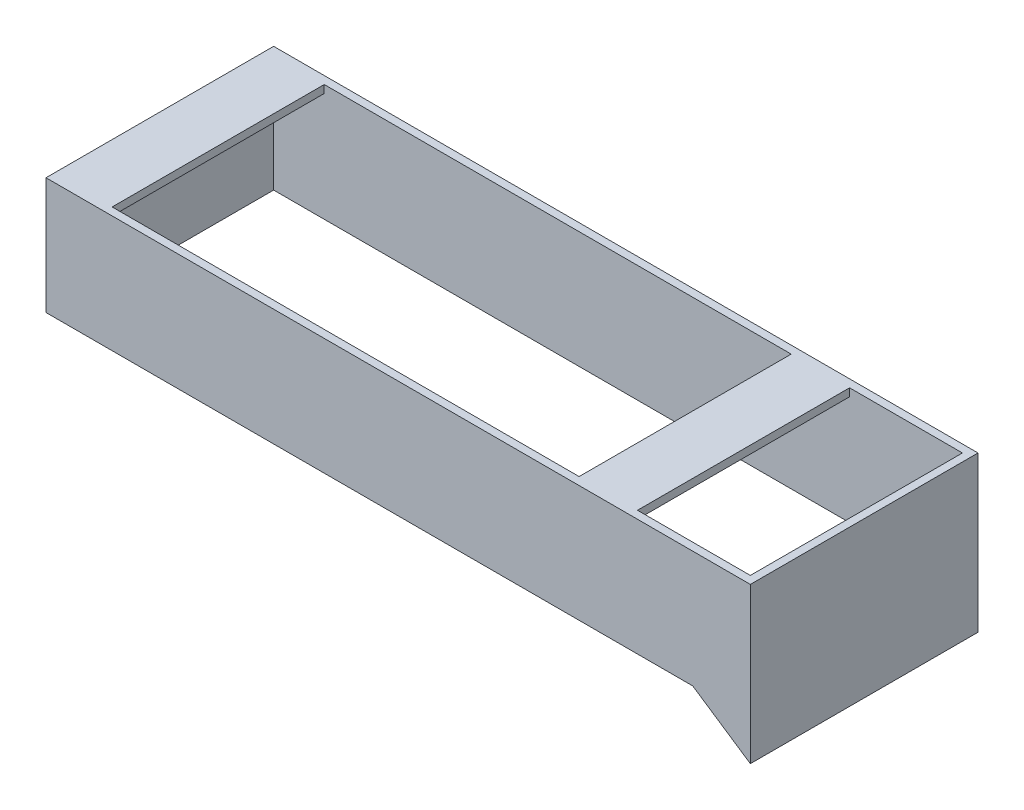
ISO-10303-21;
HEADER;
FILE_DESCRIPTION(('STEP AP214'),'2;1');
FILE_NAME('part.step','',(''),(''),'','','');
FILE_SCHEMA(('AUTOMOTIVE_DESIGN { 1 0 10303 214 1 1 1 1 }'));
ENDSEC;
DATA;
#1=APPLICATION_CONTEXT('core data for automotive mechanical design processes');
#2=APPLICATION_PROTOCOL_DEFINITION('international standard','automotive_design',2000,#1);
#3=PRODUCT_CONTEXT('',#1,'mechanical');
#4=PRODUCT('Part','Part','',(#3));
#5=PRODUCT_RELATED_PRODUCT_CATEGORY('part','',(#4));
#6=PRODUCT_DEFINITION_FORMATION('','',#4);
#7=PRODUCT_DEFINITION_CONTEXT('part definition',#1,'design');
#8=PRODUCT_DEFINITION('design','',#6,#7);
#9=PRODUCT_DEFINITION_SHAPE('','',#8);
#10=(LENGTH_UNIT() NAMED_UNIT(*) SI_UNIT(.MILLI.,.METRE.));
#11=(NAMED_UNIT(*) PLANE_ANGLE_UNIT() SI_UNIT($,.RADIAN.));
#12=(NAMED_UNIT(*) SI_UNIT($,.STERADIAN.) SOLID_ANGLE_UNIT());
#13=UNCERTAINTY_MEASURE_WITH_UNIT(LENGTH_MEASURE(1.E-05),#10,'distance_accuracy_value','');
#14=(GEOMETRIC_REPRESENTATION_CONTEXT(3) GLOBAL_UNCERTAINTY_ASSIGNED_CONTEXT((#13)) GLOBAL_UNIT_ASSIGNED_CONTEXT((#10,
#11,#12)) REPRESENTATION_CONTEXT('',''));
#15=CARTESIAN_POINT('',(0.,0.,0.));
#16=DIRECTION('',(0.,0.,1.));
#17=DIRECTION('',(1.,0.,0.));
#18=AXIS2_PLACEMENT_3D('',#15,#16,#17);
#19=CARTESIAN_POINT('',(-88.5,30.,27.25));
#20=DIRECTION('',(1.,0.,0.));
#21=DIRECTION('',(0.,0.,-1.));
#22=AXIS2_PLACEMENT_3D('',#19,#20,#21);
#23=PLANE('',#22);
#24=DIRECTION('',(0.,-1.,0.));
#25=VECTOR('',#24,1.);
#26=CARTESIAN_POINT('',(-88.5,30.,-27.25));
#27=LINE('',#26,#25);
#28=CARTESIAN_POINT('',(-88.5,28.,-27.25));
#29=VERTEX_POINT('',#28);
#30=CARTESIAN_POINT('',(-88.5,0.,-27.25));
#31=VERTEX_POINT('',#30);
#32=EDGE_CURVE('E264',#29,#31,#27,.T.);
#33=ORIENTED_EDGE('',*,*,#32,.F.);
#34=DIRECTION('',(0.,0.,1.));
#35=VECTOR('',#34,1.);
#36=CARTESIAN_POINT('',(-88.5,28.,27.25));
#37=LINE('',#36,#35);
#38=CARTESIAN_POINT('',(-88.5,28.,27.25));
#39=VERTEX_POINT('',#38);
#40=EDGE_CURVE('E204',#29,#39,#37,.T.);
#41=ORIENTED_EDGE('',*,*,#40,.T.);
#42=DIRECTION('',(0.,-1.,0.));
#43=VECTOR('',#42,1.);
#44=CARTESIAN_POINT('',(-88.5,30.,27.25));
#45=LINE('',#44,#43);
#46=CARTESIAN_POINT('',(-88.5,0.,27.25));
#47=VERTEX_POINT('',#46);
#48=EDGE_CURVE('E261',#39,#47,#45,.T.);
#49=ORIENTED_EDGE('',*,*,#48,.T.);
#50=DIRECTION('',(0.,0.,1.));
#51=VECTOR('',#50,1.);
#52=CARTESIAN_POINT('',(-88.5,0.,27.25));
#53=LINE('',#52,#51);
#54=EDGE_CURVE('E252',#31,#47,#53,.T.);
#55=ORIENTED_EDGE('',*,*,#54,.F.);
#56=EDGE_LOOP('',(#33,#41,#49,#55));
#57=FACE_BOUND('',#56,.T.);
#58=ADVANCED_FACE('F43',(#57),#23,.T.);
#59=CARTESIAN_POINT('',(0.,30.,0.));
#60=DIRECTION('',(0.,-1.,0.));
#61=DIRECTION('',(0.,0.,-1.));
#62=AXIS2_PLACEMENT_3D('',#59,#60,#61);
#63=PLANE('',#62);
#64=DIRECTION('',(0.,0.,-1.));
#65=VECTOR('',#64,1.);
#66=CARTESIAN_POINT('',(59.4977105585169,30.,-29.25));
#67=LINE('',#66,#65);
#68=CARTESIAN_POINT('',(59.4977105585169,30.,27.25));
#69=VERTEX_POINT('',#68);
#70=CARTESIAN_POINT('',(59.4977105585169,30.,-27.25));
#71=VERTEX_POINT('',#70);
#72=EDGE_CURVE('E162',#69,#71,#67,.T.);
#73=ORIENTED_EDGE('',*,*,#72,.T.);
#74=DIRECTION('',(-1.,0.,0.));
#75=VECTOR('',#74,1.);
#76=CARTESIAN_POINT('',(-88.5,30.,-27.25));
#77=LINE('',#76,#75);
#78=CARTESIAN_POINT('',(88.5,30.,-27.25));
#79=VERTEX_POINT('',#78);
#80=EDGE_CURVE('E169',#79,#71,#77,.T.);
#81=ORIENTED_EDGE('',*,*,#80,.F.);
#82=DIRECTION('',(0.,0.,-1.));
#83=VECTOR('',#82,1.);
#84=CARTESIAN_POINT('',(88.5,30.,27.25));
#85=LINE('',#84,#83);
#86=CARTESIAN_POINT('',(88.5,30.,27.25));
#87=VERTEX_POINT('',#86);
#88=EDGE_CURVE('E163',#87,#79,#85,.T.);
#89=ORIENTED_EDGE('',*,*,#88,.F.);
#90=DIRECTION('',(1.,0.,0.));
#91=VECTOR('',#90,1.);
#92=CARTESIAN_POINT('',(-88.5,30.,27.25));
#93=LINE('',#92,#91);
#94=EDGE_CURVE('E156',#69,#87,#93,.T.);
#95=ORIENTED_EDGE('',*,*,#94,.F.);
#96=EDGE_LOOP('',(#73,#81,#89,#95));
#97=FACE_BOUND('',#96,.T.);
#98=DIRECTION('',(0.,0.,1.));
#99=VECTOR('',#98,1.);
#100=CARTESIAN_POINT('',(44.4977105585169,30.,-29.25));
#101=LINE('',#100,#99);
#102=CARTESIAN_POINT('',(44.4977105585169,30.,-27.25));
#103=VERTEX_POINT('',#102);
#104=CARTESIAN_POINT('',(44.4977105585169,30.,27.25));
#105=VERTEX_POINT('',#104);
#106=EDGE_CURVE('E179',#103,#105,#101,.T.);
#107=ORIENTED_EDGE('',*,*,#106,.T.);
#108=CARTESIAN_POINT('',(-75.5,30.,27.25));
#109=VERTEX_POINT('',#108);
#110=EDGE_CURVE('E168',#109,#105,#93,.T.);
#111=ORIENTED_EDGE('',*,*,#110,.F.);
#112=DIRECTION('',(0.,0.,-1.));
#113=VECTOR('',#112,1.);
#114=CARTESIAN_POINT('',(-75.5,30.,-29.25));
#115=LINE('',#114,#113);
#116=CARTESIAN_POINT('',(-75.5,30.,-27.25));
#117=VERTEX_POINT('',#116);
#118=EDGE_CURVE('E199',#109,#117,#115,.T.);
#119=ORIENTED_EDGE('',*,*,#118,.T.);
#120=EDGE_CURVE('E243',#103,#117,#77,.T.);
#121=ORIENTED_EDGE('',*,*,#120,.F.);
#122=EDGE_LOOP('',(#107,#111,#119,#121));
#123=FACE_BOUND('',#122,.T.);
#124=DIRECTION('',(1.,0.,0.));
#125=VECTOR('',#124,1.);
#126=CARTESIAN_POINT('',(-90.5,30.,29.25));
#127=LINE('',#126,#125);
#128=CARTESIAN_POINT('',(-90.5,30.,29.25));
#129=VERTEX_POINT('',#128);
#130=CARTESIAN_POINT('',(90.5,30.,29.25));
#131=VERTEX_POINT('',#130);
#132=EDGE_CURVE('E283',#129,#131,#127,.T.);
#133=ORIENTED_EDGE('',*,*,#132,.T.);
#134=DIRECTION('',(0.,0.,-1.));
#135=VECTOR('',#134,1.);
#136=CARTESIAN_POINT('',(90.5,30.,29.25));
#137=LINE('',#136,#135);
#138=CARTESIAN_POINT('',(90.5,30.,-29.25));
#139=VERTEX_POINT('',#138);
#140=EDGE_CURVE('E272',#131,#139,#137,.T.);
#141=ORIENTED_EDGE('',*,*,#140,.T.);
#142=DIRECTION('',(-1.,0.,0.));
#143=VECTOR('',#142,1.);
#144=CARTESIAN_POINT('',(-90.5,30.,-29.25));
#145=LINE('',#144,#143);
#146=CARTESIAN_POINT('',(-90.5,30.,-29.25));
#147=VERTEX_POINT('',#146);
#148=EDGE_CURVE('E276',#139,#147,#145,.T.);
#149=ORIENTED_EDGE('',*,*,#148,.T.);
#150=DIRECTION('',(0.,0.,1.));
#151=VECTOR('',#150,1.);
#152=CARTESIAN_POINT('',(-90.5,30.,29.25));
#153=LINE('',#152,#151);
#154=EDGE_CURVE('E280',#147,#129,#153,.T.);
#155=ORIENTED_EDGE('',*,*,#154,.T.);
#156=EDGE_LOOP('',(#133,#141,#149,#155));
#157=FACE_BOUND('',#156,.T.);
#158=ADVANCED_FACE('F158',(#97,#123,#157),#63,.F.);
#159=CARTESIAN_POINT('',(0.,0.,0.));
#160=DIRECTION('',(0.,-1.,0.));
#161=DIRECTION('',(0.,0.,-1.));
#162=AXIS2_PLACEMENT_3D('',#159,#160,#161);
#163=PLANE('',#162);
#164=DIRECTION('',(0.,0.,-1.));
#165=VECTOR('',#164,1.);
#166=CARTESIAN_POINT('',(75.7,0.,29.25));
#167=LINE('',#166,#165);
#168=CARTESIAN_POINT('',(75.7,0.,29.25));
#169=VERTEX_POINT('',#168);
#170=CARTESIAN_POINT('',(75.7,0.,27.25));
#171=VERTEX_POINT('',#170);
#172=EDGE_CURVE('E233',#169,#171,#167,.T.);
#173=ORIENTED_EDGE('',*,*,#172,.F.);
#174=DIRECTION('',(1.,0.,0.));
#175=VECTOR('',#174,1.);
#176=CARTESIAN_POINT('',(-90.5,0.,29.25));
#177=LINE('',#176,#175);
#178=CARTESIAN_POINT('',(-90.5,0.,29.25));
#179=VERTEX_POINT('',#178);
#180=EDGE_CURVE('E277',#179,#169,#177,.T.);
#181=ORIENTED_EDGE('',*,*,#180,.F.);
#182=DIRECTION('',(0.,0.,1.));
#183=VECTOR('',#182,1.);
#184=CARTESIAN_POINT('',(-90.5,0.,29.25));
#185=LINE('',#184,#183);
#186=CARTESIAN_POINT('',(-90.5,0.,-29.25));
#187=VERTEX_POINT('',#186);
#188=EDGE_CURVE('E290',#187,#179,#185,.T.);
#189=ORIENTED_EDGE('',*,*,#188,.F.);
#190=DIRECTION('',(-1.,0.,0.));
#191=VECTOR('',#190,1.);
#192=CARTESIAN_POINT('',(-90.5,0.,-29.25));
#193=LINE('',#192,#191);
#194=CARTESIAN_POINT('',(75.7,0.,-29.25));
#195=VERTEX_POINT('',#194);
#196=EDGE_CURVE('E271',#195,#187,#193,.T.);
#197=ORIENTED_EDGE('',*,*,#196,.F.);
#198=CARTESIAN_POINT('',(75.7,0.,-27.25));
#199=VERTEX_POINT('',#198);
#200=EDGE_CURVE('E240',#199,#195,#167,.T.);
#201=ORIENTED_EDGE('',*,*,#200,.F.);
#202=DIRECTION('',(-1.,0.,0.));
#203=VECTOR('',#202,1.);
#204=CARTESIAN_POINT('',(-88.5,0.,-27.25));
#205=LINE('',#204,#203);
#206=EDGE_CURVE('E237',#199,#31,#205,.T.);
#207=ORIENTED_EDGE('',*,*,#206,.T.);
#208=ORIENTED_EDGE('',*,*,#54,.T.);
#209=DIRECTION('',(1.,0.,0.));
#210=VECTOR('',#209,1.);
#211=CARTESIAN_POINT('',(-88.5,0.,27.25));
#212=LINE('',#211,#210);
#213=EDGE_CURVE('E244',#47,#171,#212,.T.);
#214=ORIENTED_EDGE('',*,*,#213,.T.);
#215=EDGE_LOOP('',(#173,#181,#189,#197,#201,#207,#208,#214));
#216=FACE_BOUND('',#215,.T.);
#217=ADVANCED_FACE('F344',(#216),#163,.T.);
#218=CARTESIAN_POINT('',(90.5,30.,29.25));
#219=DIRECTION('',(-1.,0.,0.));
#220=DIRECTION('',(0.,0.,1.));
#221=AXIS2_PLACEMENT_3D('',#218,#219,#220);
#222=PLANE('',#221);
#223=DIRECTION('',(0.,-1.,0.));
#224=VECTOR('',#223,1.);
#225=CARTESIAN_POINT('',(90.5,30.,29.25));
#226=LINE('',#225,#224);
#227=CARTESIAN_POINT('',(90.5,-9.9,29.25));
#228=VERTEX_POINT('',#227);
#229=EDGE_CURVE('E286',#131,#228,#226,.T.);
#230=ORIENTED_EDGE('',*,*,#229,.T.);
#231=DIRECTION('',(0.,0.,1.));
#232=VECTOR('',#231,1.);
#233=CARTESIAN_POINT('',(90.5,-9.9,29.25));
#234=LINE('',#233,#232);
#235=CARTESIAN_POINT('',(90.5,-9.9,-29.25));
#236=VERTEX_POINT('',#235);
#237=EDGE_CURVE('E234',#236,#228,#234,.T.);
#238=ORIENTED_EDGE('',*,*,#237,.F.);
#239=DIRECTION('',(0.,-1.,0.));
#240=VECTOR('',#239,1.);
#241=CARTESIAN_POINT('',(90.5,30.,-29.25));
#242=LINE('',#241,#240);
#243=EDGE_CURVE('E306',#139,#236,#242,.T.);
#244=ORIENTED_EDGE('',*,*,#243,.F.);
#245=ORIENTED_EDGE('',*,*,#140,.F.);
#246=EDGE_LOOP('',(#230,#238,#244,#245));
#247=FACE_BOUND('',#246,.T.);
#248=ADVANCED_FACE('F45',(#247),#222,.F.);
#249=CARTESIAN_POINT('',(-90.5,30.,-29.25));
#250=DIRECTION('',(0.,0.,1.));
#251=DIRECTION('',(1.,0.,0.));
#252=AXIS2_PLACEMENT_3D('',#249,#250,#251);
#253=PLANE('',#252);
#254=DIRECTION('',(0.,-1.,0.));
#255=VECTOR('',#254,1.);
#256=CARTESIAN_POINT('',(-90.5,30.,-29.25));
#257=LINE('',#256,#255);
#258=EDGE_CURVE('E303',#147,#187,#257,.T.);
#259=ORIENTED_EDGE('',*,*,#258,.F.);
#260=ORIENTED_EDGE('',*,*,#148,.F.);
#261=ORIENTED_EDGE('',*,*,#243,.T.);
#262=DIRECTION('',(0.831185267022605,-0.555995550238095,0.));
#263=VECTOR('',#262,1.);
#264=CARTESIAN_POINT('',(90.5,-9.9,-29.25));
#265=LINE('',#264,#263);
#266=EDGE_CURVE('E217',#195,#236,#265,.T.);
#267=ORIENTED_EDGE('',*,*,#266,.F.);
#268=ORIENTED_EDGE('',*,*,#196,.T.);
#269=EDGE_LOOP('',(#259,#260,#261,#267,#268));
#270=FACE_BOUND('',#269,.T.);
#271=ADVANCED_FACE('F365',(#270),#253,.F.);
#272=CARTESIAN_POINT('',(-90.5,30.,29.25));
#273=DIRECTION('',(1.,0.,0.));
#274=DIRECTION('',(0.,0.,-1.));
#275=AXIS2_PLACEMENT_3D('',#272,#273,#274);
#276=PLANE('',#275);
#277=ORIENTED_EDGE('',*,*,#258,.T.);
#278=ORIENTED_EDGE('',*,*,#188,.T.);
#279=DIRECTION('',(0.,-1.,0.));
#280=VECTOR('',#279,1.);
#281=CARTESIAN_POINT('',(-90.5,30.,29.25));
#282=LINE('',#281,#280);
#283=EDGE_CURVE('E300',#129,#179,#282,.T.);
#284=ORIENTED_EDGE('',*,*,#283,.F.);
#285=ORIENTED_EDGE('',*,*,#154,.F.);
#286=EDGE_LOOP('',(#277,#278,#284,#285));
#287=FACE_BOUND('',#286,.T.);
#288=ADVANCED_FACE('F362',(#287),#276,.F.);
#289=CARTESIAN_POINT('',(-90.5,30.,29.25));
#290=DIRECTION('',(0.,0.,-1.));
#291=DIRECTION('',(-1.,0.,0.));
#292=AXIS2_PLACEMENT_3D('',#289,#290,#291);
#293=PLANE('',#292);
#294=ORIENTED_EDGE('',*,*,#229,.F.);
#295=ORIENTED_EDGE('',*,*,#132,.F.);
#296=ORIENTED_EDGE('',*,*,#283,.T.);
#297=ORIENTED_EDGE('',*,*,#180,.T.);
#298=DIRECTION('',(0.831185267022605,-0.555995550238095,0.));
#299=VECTOR('',#298,1.);
#300=CARTESIAN_POINT('',(-52.9864784734268,86.0808200599275,29.25));
#301=LINE('',#300,#299);
#302=EDGE_CURVE('E229',#169,#228,#301,.T.);
#303=ORIENTED_EDGE('',*,*,#302,.T.);
#304=EDGE_LOOP('',(#294,#295,#296,#297,#303));
#305=FACE_BOUND('',#304,.T.);
#306=ADVANCED_FACE('F354',(#305),#293,.F.);
#307=CARTESIAN_POINT('',(88.5,30.,27.25));
#308=DIRECTION('',(-1.,0.,0.));
#309=DIRECTION('',(0.,0.,1.));
#310=AXIS2_PLACEMENT_3D('',#307,#308,#309);
#311=PLANE('',#310);
#312=DIRECTION('',(0.,0.,-1.));
#313=VECTOR('',#312,1.);
#314=CARTESIAN_POINT('',(88.5,-8.56216216216216,27.25));
#315=LINE('',#314,#313);
#316=CARTESIAN_POINT('',(88.5,-8.56216216216216,27.25));
#317=VERTEX_POINT('',#316);
#318=CARTESIAN_POINT('',(88.5,-8.56216216216216,-27.25));
#319=VERTEX_POINT('',#318);
#320=EDGE_CURVE('E223',#317,#319,#315,.T.);
#321=ORIENTED_EDGE('',*,*,#320,.F.);
#322=DIRECTION('',(0.,-1.,0.));
#323=VECTOR('',#322,1.);
#324=CARTESIAN_POINT('',(88.5,30.,27.25));
#325=LINE('',#324,#323);
#326=EDGE_CURVE('E248',#87,#317,#325,.T.);
#327=ORIENTED_EDGE('',*,*,#326,.F.);
#328=ORIENTED_EDGE('',*,*,#88,.T.);
#329=DIRECTION('',(0.,-1.,0.));
#330=VECTOR('',#329,1.);
#331=CARTESIAN_POINT('',(88.5,30.,-27.25));
#332=LINE('',#331,#330);
#333=EDGE_CURVE('E267',#79,#319,#332,.T.);
#334=ORIENTED_EDGE('',*,*,#333,.T.);
#335=EDGE_LOOP('',(#321,#327,#328,#334));
#336=FACE_BOUND('',#335,.T.);
#337=ADVANCED_FACE('F352',(#336),#311,.T.);
#338=CARTESIAN_POINT('',(-88.5,30.,-27.25));
#339=DIRECTION('',(0.,0.,1.));
#340=DIRECTION('',(1.,0.,0.));
#341=AXIS2_PLACEMENT_3D('',#338,#339,#340);
#342=PLANE('',#341);
#343=DIRECTION('',(0.,1.,0.));
#344=VECTOR('',#343,1.);
#345=CARTESIAN_POINT('',(59.4977105585169,30.,-27.25));
#346=LINE('',#345,#344);
#347=CARTESIAN_POINT('',(59.4977105585169,28.,-27.25));
#348=VERTEX_POINT('',#347);
#349=EDGE_CURVE('E59',#348,#71,#346,.T.);
#350=ORIENTED_EDGE('',*,*,#349,.F.);
#351=DIRECTION('',(1.,0.,0.));
#352=VECTOR('',#351,1.);
#353=CARTESIAN_POINT('',(-88.5,28.,-27.25));
#354=LINE('',#353,#352);
#355=CARTESIAN_POINT('',(44.4977105585169,28.,-27.25));
#356=VERTEX_POINT('',#355);
#357=EDGE_CURVE('E63',#356,#348,#354,.T.);
#358=ORIENTED_EDGE('',*,*,#357,.F.);
#359=DIRECTION('',(0.,-1.,0.));
#360=VECTOR('',#359,1.);
#361=CARTESIAN_POINT('',(44.4977105585169,30.,-27.25));
#362=LINE('',#361,#360);
#363=EDGE_CURVE('E183',#103,#356,#362,.T.);
#364=ORIENTED_EDGE('',*,*,#363,.F.);
#365=ORIENTED_EDGE('',*,*,#120,.T.);
#366=DIRECTION('',(0.,1.,0.));
#367=VECTOR('',#366,1.);
#368=CARTESIAN_POINT('',(-75.5,30.,-27.25));
#369=LINE('',#368,#367);
#370=CARTESIAN_POINT('',(-75.5,28.,-27.25));
#371=VERTEX_POINT('',#370);
#372=EDGE_CURVE('E213',#371,#117,#369,.T.);
#373=ORIENTED_EDGE('',*,*,#372,.F.);
#374=DIRECTION('',(-1.,0.,0.));
#375=VECTOR('',#374,1.);
#376=CARTESIAN_POINT('',(-88.5,28.,-27.25));
#377=LINE('',#376,#375);
#378=EDGE_CURVE('E210',#371,#29,#377,.T.);
#379=ORIENTED_EDGE('',*,*,#378,.T.);
#380=ORIENTED_EDGE('',*,*,#32,.T.);
#381=ORIENTED_EDGE('',*,*,#206,.F.);
#382=DIRECTION('',(-0.831185267022605,0.555995550238095,0.));
#383=VECTOR('',#382,1.);
#384=CARTESIAN_POINT('',(-51.6047405771959,85.1565494401515,-27.25));
#385=LINE('',#384,#383);
#386=EDGE_CURVE('E226',#319,#199,#385,.T.);
#387=ORIENTED_EDGE('',*,*,#386,.F.);
#388=ORIENTED_EDGE('',*,*,#333,.F.);
#389=ORIENTED_EDGE('',*,*,#80,.T.);
#390=EDGE_LOOP('',(#350,#358,#364,#365,#373,#379,#380,#381,#387,#388,#389));
#391=FACE_BOUND('',#390,.T.);
#392=ADVANCED_FACE('F328',(#391),#342,.T.);
#393=CARTESIAN_POINT('',(-88.5,30.,27.25));
#394=DIRECTION('',(0.,0.,-1.));
#395=DIRECTION('',(-1.,0.,0.));
#396=AXIS2_PLACEMENT_3D('',#393,#394,#395);
#397=PLANE('',#396);
#398=DIRECTION('',(0.,-1.,0.));
#399=VECTOR('',#398,1.);
#400=CARTESIAN_POINT('',(59.4977105585169,30.,27.25));
#401=LINE('',#400,#399);
#402=CARTESIAN_POINT('',(59.4977105585169,28.,27.25));
#403=VERTEX_POINT('',#402);
#404=EDGE_CURVE('E11',#69,#403,#401,.T.);
#405=ORIENTED_EDGE('',*,*,#404,.F.);
#406=ORIENTED_EDGE('',*,*,#94,.T.);
#407=ORIENTED_EDGE('',*,*,#326,.T.);
#408=DIRECTION('',(0.831185267022605,-0.555995550238095,0.));
#409=VECTOR('',#408,1.);
#410=CARTESIAN_POINT('',(-51.6047405771959,85.1565494401515,27.25));
#411=LINE('',#410,#409);
#412=EDGE_CURVE('E220',#171,#317,#411,.T.);
#413=ORIENTED_EDGE('',*,*,#412,.F.);
#414=ORIENTED_EDGE('',*,*,#213,.F.);
#415=ORIENTED_EDGE('',*,*,#48,.F.);
#416=DIRECTION('',(1.,0.,0.));
#417=VECTOR('',#416,1.);
#418=CARTESIAN_POINT('',(-88.5,28.,27.25));
#419=LINE('',#418,#417);
#420=CARTESIAN_POINT('',(-75.5,28.,27.25));
#421=VERTEX_POINT('',#420);
#422=EDGE_CURVE('E310',#39,#421,#419,.T.);
#423=ORIENTED_EDGE('',*,*,#422,.T.);
#424=DIRECTION('',(0.,-1.,0.));
#425=VECTOR('',#424,1.);
#426=CARTESIAN_POINT('',(-75.5,30.,27.25));
#427=LINE('',#426,#425);
#428=EDGE_CURVE('E313',#109,#421,#427,.T.);
#429=ORIENTED_EDGE('',*,*,#428,.F.);
#430=ORIENTED_EDGE('',*,*,#110,.T.);
#431=DIRECTION('',(0.,1.,0.));
#432=VECTOR('',#431,1.);
#433=CARTESIAN_POINT('',(44.4977105585169,30.,27.25));
#434=LINE('',#433,#432);
#435=CARTESIAN_POINT('',(44.4977105585169,28.,27.25));
#436=VERTEX_POINT('',#435);
#437=EDGE_CURVE('E52',#436,#105,#434,.T.);
#438=ORIENTED_EDGE('',*,*,#437,.F.);
#439=DIRECTION('',(-1.,0.,0.));
#440=VECTOR('',#439,1.);
#441=CARTESIAN_POINT('',(-88.5,28.,27.25));
#442=LINE('',#441,#440);
#443=EDGE_CURVE('E173',#403,#436,#442,.T.);
#444=ORIENTED_EDGE('',*,*,#443,.F.);
#445=EDGE_LOOP('',(#405,#406,#407,#413,#414,#415,#423,#429,#430,#438,#444));
#446=FACE_BOUND('',#445,.T.);
#447=ADVANCED_FACE('F171',(#446),#397,.T.);
#448=CARTESIAN_POINT('',(90.5,-9.9,970.75));
#449=DIRECTION('',(0.555995550238095,0.831185267022605,0.));
#450=DIRECTION('',(-0.831185267022605,0.555995550238095,0.));
#451=AXIS2_PLACEMENT_3D('',#448,#449,#450);
#452=PLANE('',#451);
#453=ORIENTED_EDGE('',*,*,#172,.T.);
#454=ORIENTED_EDGE('',*,*,#412,.T.);
#455=ORIENTED_EDGE('',*,*,#320,.T.);
#456=ORIENTED_EDGE('',*,*,#386,.T.);
#457=ORIENTED_EDGE('',*,*,#200,.T.);
#458=ORIENTED_EDGE('',*,*,#266,.T.);
#459=ORIENTED_EDGE('',*,*,#237,.T.);
#460=ORIENTED_EDGE('',*,*,#302,.F.);
#461=EDGE_LOOP('',(#453,#454,#455,#456,#457,#458,#459,#460));
#462=FACE_BOUND('',#461,.T.);
#463=ADVANCED_FACE('F389',(#462),#452,.F.);
#464=CARTESIAN_POINT('',(-75.5,28.,-29.25));
#465=DIRECTION('',(1.,0.,0.));
#466=DIRECTION('',(0.,0.,-1.));
#467=AXIS2_PLACEMENT_3D('',#464,#465,#466);
#468=PLANE('',#467);
#469=DIRECTION('',(0.,0.,-1.));
#470=VECTOR('',#469,1.);
#471=CARTESIAN_POINT('',(-75.5,28.,-29.25));
#472=LINE('',#471,#470);
#473=EDGE_CURVE('E200',#421,#371,#472,.T.);
#474=ORIENTED_EDGE('',*,*,#473,.T.);
#475=ORIENTED_EDGE('',*,*,#372,.T.);
#476=ORIENTED_EDGE('',*,*,#118,.F.);
#477=ORIENTED_EDGE('',*,*,#428,.T.);
#478=EDGE_LOOP('',(#474,#475,#476,#477));
#479=FACE_BOUND('',#478,.T.);
#480=ADVANCED_FACE('F402',(#479),#468,.T.);
#481=CARTESIAN_POINT('',(0.,28.,0.));
#482=DIRECTION('',(0.,1.,0.));
#483=DIRECTION('',(0.,0.,1.));
#484=AXIS2_PLACEMENT_3D('',#481,#482,#483);
#485=PLANE('',#484);
#486=ORIENTED_EDGE('',*,*,#378,.F.);
#487=ORIENTED_EDGE('',*,*,#473,.F.);
#488=ORIENTED_EDGE('',*,*,#422,.F.);
#489=ORIENTED_EDGE('',*,*,#40,.F.);
#490=EDGE_LOOP('',(#486,#487,#488,#489));
#491=FACE_BOUND('',#490,.T.);
#492=ADVANCED_FACE('F400',(#491),#485,.F.);
#493=CARTESIAN_POINT('',(59.4977105585169,28.,-29.25));
#494=DIRECTION('',(1.,0.,0.));
#495=DIRECTION('',(0.,0.,-1.));
#496=AXIS2_PLACEMENT_3D('',#493,#494,#495);
#497=PLANE('',#496);
#498=DIRECTION('',(0.,0.,-1.));
#499=VECTOR('',#498,1.);
#500=CARTESIAN_POINT('',(59.4977105585169,28.,-29.25));
#501=LINE('',#500,#499);
#502=EDGE_CURVE('E186',#403,#348,#501,.T.);
#503=ORIENTED_EDGE('',*,*,#502,.T.);
#504=ORIENTED_EDGE('',*,*,#349,.T.);
#505=ORIENTED_EDGE('',*,*,#72,.F.);
#506=ORIENTED_EDGE('',*,*,#404,.T.);
#507=EDGE_LOOP('',(#503,#504,#505,#506));
#508=FACE_BOUND('',#507,.T.);
#509=ADVANCED_FACE('F177',(#508),#497,.T.);
#510=CARTESIAN_POINT('',(44.4977105585169,28.,-29.25));
#511=DIRECTION('',(-1.,0.,0.));
#512=DIRECTION('',(0.,0.,1.));
#513=AXIS2_PLACEMENT_3D('',#510,#511,#512);
#514=PLANE('',#513);
#515=ORIENTED_EDGE('',*,*,#106,.F.);
#516=ORIENTED_EDGE('',*,*,#363,.T.);
#517=DIRECTION('',(0.,0.,1.));
#518=VECTOR('',#517,1.);
#519=CARTESIAN_POINT('',(44.4977105585169,28.,-29.25));
#520=LINE('',#519,#518);
#521=EDGE_CURVE('E189',#356,#436,#520,.T.);
#522=ORIENTED_EDGE('',*,*,#521,.T.);
#523=ORIENTED_EDGE('',*,*,#437,.T.);
#524=EDGE_LOOP('',(#515,#516,#522,#523));
#525=FACE_BOUND('',#524,.T.);
#526=ADVANCED_FACE('F322',(#525),#514,.T.);
#527=CARTESIAN_POINT('',(0.,28.,0.));
#528=DIRECTION('',(0.,-1.,0.));
#529=DIRECTION('',(0.,0.,-1.));
#530=AXIS2_PLACEMENT_3D('',#527,#528,#529);
#531=PLANE('',#530);
#532=ORIENTED_EDGE('',*,*,#521,.F.);
#533=ORIENTED_EDGE('',*,*,#357,.T.);
#534=ORIENTED_EDGE('',*,*,#502,.F.);
#535=ORIENTED_EDGE('',*,*,#443,.T.);
#536=EDGE_LOOP('',(#532,#533,#534,#535));
#537=FACE_BOUND('',#536,.T.);
#538=ADVANCED_FACE('F330',(#537),#531,.T.);
#539=CLOSED_SHELL('',(#58,#158,#217,#248,#271,#288,#306,#337,#392,#447,#463,#480,#492,#509,#526,#538));
#540=MANIFOLD_SOLID_BREP('B2',#539);
#541=ADVANCED_BREP_SHAPE_REPRESENTATION('',(#18,#540),#14);
#542=SHAPE_DEFINITION_REPRESENTATION(#9,#541);
ENDSEC;
END-ISO-10303-21;
